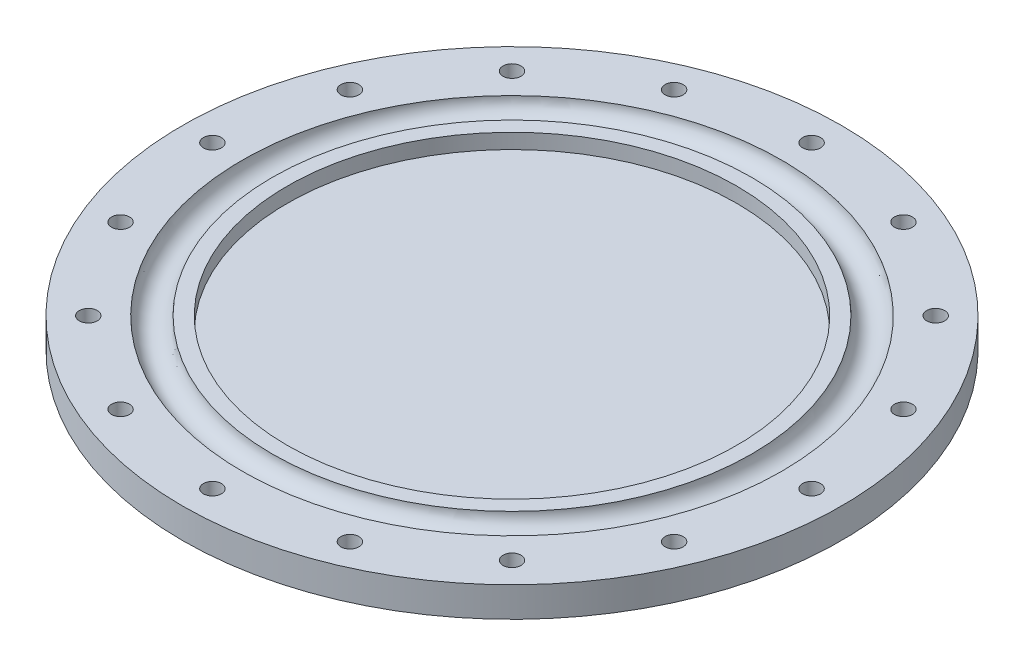
ISO-10303-21;
HEADER;
FILE_DESCRIPTION(('STEP AP214'),'2;1');
FILE_NAME('part.step','',(''),(''),'','','');
FILE_SCHEMA(('AUTOMOTIVE_DESIGN { 1 0 10303 214 1 1 1 1 }'));
ENDSEC;
DATA;
#1=APPLICATION_CONTEXT('core data for automotive mechanical design processes');
#2=APPLICATION_PROTOCOL_DEFINITION('international standard','automotive_design',2000,#1);
#3=PRODUCT_CONTEXT('',#1,'mechanical');
#4=PRODUCT('Part','Part','',(#3));
#5=PRODUCT_RELATED_PRODUCT_CATEGORY('part','',(#4));
#6=PRODUCT_DEFINITION_FORMATION('','',#4);
#7=PRODUCT_DEFINITION_CONTEXT('part definition',#1,'design');
#8=PRODUCT_DEFINITION('design','',#6,#7);
#9=PRODUCT_DEFINITION_SHAPE('','',#8);
#10=(LENGTH_UNIT() NAMED_UNIT(*) SI_UNIT(.MILLI.,.METRE.));
#11=(NAMED_UNIT(*) PLANE_ANGLE_UNIT() SI_UNIT($,.RADIAN.));
#12=(NAMED_UNIT(*) SI_UNIT($,.STERADIAN.) SOLID_ANGLE_UNIT());
#13=UNCERTAINTY_MEASURE_WITH_UNIT(LENGTH_MEASURE(1.E-05),#10,'distance_accuracy_value','');
#14=(GEOMETRIC_REPRESENTATION_CONTEXT(3) GLOBAL_UNCERTAINTY_ASSIGNED_CONTEXT((#13)) GLOBAL_UNIT_ASSIGNED_CONTEXT((#10,
#11,#12)) REPRESENTATION_CONTEXT('',''));
#15=CARTESIAN_POINT('',(0.,0.,0.));
#16=DIRECTION('',(0.,0.,1.));
#17=DIRECTION('',(1.,0.,0.));
#18=AXIS2_PLACEMENT_3D('',#15,#16,#17);
#19=CARTESIAN_POINT('',(0.,10.,0.));
#20=DIRECTION('',(0.,1.,0.));
#21=DIRECTION('',(0.,0.,1.));
#22=AXIS2_PLACEMENT_3D('',#19,#20,#21);
#23=PLANE('',#22);
#24=CARTESIAN_POINT('',(0.,10.,0.));
#25=DIRECTION('',(0.,1.,0.));
#26=DIRECTION('',(0.,0.,1.));
#27=AXIS2_PLACEMENT_3D('',#24,#25,#26);
#28=CIRCLE('',#27,110.);
#29=CARTESIAN_POINT('',(0.,10.,110.));
#30=VERTEX_POINT('',#29);
#31=EDGE_CURVE('E63',#30,#30,#28,.T.);
#32=ORIENTED_EDGE('',*,*,#31,.T.);
#33=EDGE_LOOP('',(#32));
#34=FACE_BOUND('',#33,.T.);
#35=CARTESIAN_POINT('',(0.,10.,-100.));
#36=DIRECTION('',(0.,1.,0.));
#37=DIRECTION('',(0.,0.,1.));
#38=AXIS2_PLACEMENT_3D('',#35,#36,#37);
#39=CIRCLE('',#38,3.);
#40=CARTESIAN_POINT('',(0.,10.,-97.));
#41=VERTEX_POINT('',#40);
#42=EDGE_CURVE('E131',#41,#41,#39,.T.);
#43=ORIENTED_EDGE('',*,*,#42,.F.);
#44=EDGE_LOOP('',(#43));
#45=FACE_BOUND('',#44,.T.);
#46=CARTESIAN_POINT('',(38.2683432365091,10.,-92.3879532511297));
#47=DIRECTION('',(0.,1.,0.));
#48=DIRECTION('',(0.,0.,1.));
#49=AXIS2_PLACEMENT_3D('',#46,#47,#48);
#50=CIRCLE('',#49,3.);
#51=CARTESIAN_POINT('',(38.2683432365091,10.,-89.3879532511297));
#52=VERTEX_POINT('',#51);
#53=EDGE_CURVE('E128',#52,#52,#50,.T.);
#54=ORIENTED_EDGE('',*,*,#53,.F.);
#55=EDGE_LOOP('',(#54));
#56=FACE_BOUND('',#55,.T.);
#57=CARTESIAN_POINT('',(70.7106781186556,10.,-70.7106781186567));
#58=DIRECTION('',(0.,1.,0.));
#59=DIRECTION('',(0.,0.,1.));
#60=AXIS2_PLACEMENT_3D('',#57,#58,#59);
#61=CIRCLE('',#60,3.00000000000001);
#62=CARTESIAN_POINT('',(70.7106781186556,10.,-67.7106781186567));
#63=VERTEX_POINT('',#62);
#64=EDGE_CURVE('E125',#63,#63,#61,.T.);
#65=ORIENTED_EDGE('',*,*,#64,.F.);
#66=EDGE_LOOP('',(#65));
#67=FACE_BOUND('',#66,.T.);
#68=CARTESIAN_POINT('',(92.3879532511304,10.,-38.2683432365115));
#69=DIRECTION('',(0.,1.,0.));
#70=DIRECTION('',(0.,0.,1.));
#71=AXIS2_PLACEMENT_3D('',#68,#69,#70);
#72=CIRCLE('',#71,3.00000000000001);
#73=CARTESIAN_POINT('',(92.3879532511304,10.,-35.2683432365115));
#74=VERTEX_POINT('',#73);
#75=EDGE_CURVE('E122',#74,#74,#72,.T.);
#76=ORIENTED_EDGE('',*,*,#75,.F.);
#77=EDGE_LOOP('',(#76));
#78=FACE_BOUND('',#77,.T.);
#79=CARTESIAN_POINT('',(100.000000000003,10.,-2.76131949507121E-12));
#80=DIRECTION('',(0.,1.,0.));
#81=DIRECTION('',(0.,0.,1.));
#82=AXIS2_PLACEMENT_3D('',#79,#80,#81);
#83=CIRCLE('',#82,3.00000000000001);
#84=CARTESIAN_POINT('',(100.000000000003,10.,2.99999999999725));
#85=VERTEX_POINT('',#84);
#86=EDGE_CURVE('E119',#85,#85,#83,.T.);
#87=ORIENTED_EDGE('',*,*,#86,.F.);
#88=EDGE_LOOP('',(#87));
#89=FACE_BOUND('',#88,.T.);
#90=CARTESIAN_POINT('',(92.3879532511325,10.,38.2683432365064));
#91=DIRECTION('',(0.,1.,0.));
#92=DIRECTION('',(0.,0.,1.));
#93=AXIS2_PLACEMENT_3D('',#90,#91,#92);
#94=CIRCLE('',#93,3.00000000000001);
#95=CARTESIAN_POINT('',(92.3879532511325,10.,41.2683432365064));
#96=VERTEX_POINT('',#95);
#97=EDGE_CURVE('E116',#96,#96,#94,.T.);
#98=ORIENTED_EDGE('',*,*,#97,.F.);
#99=EDGE_LOOP('',(#98));
#100=FACE_BOUND('',#99,.T.);
#101=CARTESIAN_POINT('',(70.7106781186595,10.,70.7106781186528));
#102=DIRECTION('',(0.,1.,0.));
#103=DIRECTION('',(0.,0.,1.));
#104=AXIS2_PLACEMENT_3D('',#101,#102,#103);
#105=CIRCLE('',#104,3.00000000000001);
#106=CARTESIAN_POINT('',(70.7106781186595,10.,73.7106781186528));
#107=VERTEX_POINT('',#106);
#108=EDGE_CURVE('E113',#107,#107,#105,.T.);
#109=ORIENTED_EDGE('',*,*,#108,.F.);
#110=EDGE_LOOP('',(#109));
#111=FACE_BOUND('',#110,.T.);
#112=CARTESIAN_POINT('',(38.2683432365143,10.,92.3879532511276));
#113=DIRECTION('',(0.,1.,0.));
#114=DIRECTION('',(0.,0.,1.));
#115=AXIS2_PLACEMENT_3D('',#112,#113,#114);
#116=CIRCLE('',#115,3.);
#117=CARTESIAN_POINT('',(38.2683432365143,10.,95.3879532511276));
#118=VERTEX_POINT('',#117);
#119=EDGE_CURVE('E110',#118,#118,#116,.T.);
#120=ORIENTED_EDGE('',*,*,#119,.F.);
#121=EDGE_LOOP('',(#120));
#122=FACE_BOUND('',#121,.T.);
#123=CARTESIAN_POINT('',(5.52263899014242E-12,10.,100.));
#124=DIRECTION('',(0.,1.,0.));
#125=DIRECTION('',(0.,0.,1.));
#126=AXIS2_PLACEMENT_3D('',#123,#124,#125);
#127=CIRCLE('',#126,3.);
#128=CARTESIAN_POINT('',(5.52263899014242E-12,10.,103.));
#129=VERTEX_POINT('',#128);
#130=EDGE_CURVE('E107',#129,#129,#127,.T.);
#131=ORIENTED_EDGE('',*,*,#130,.F.);
#132=EDGE_LOOP('',(#131));
#133=FACE_BOUND('',#132,.T.);
#134=CARTESIAN_POINT('',(-38.2683432365037,10.,92.3879532511297));
#135=DIRECTION('',(0.,1.,0.));
#136=DIRECTION('',(0.,0.,1.));
#137=AXIS2_PLACEMENT_3D('',#134,#135,#136);
#138=CIRCLE('',#137,3.);
#139=CARTESIAN_POINT('',(-38.2683432365037,10.,95.3879532511298));
#140=VERTEX_POINT('',#139);
#141=EDGE_CURVE('E104',#140,#140,#138,.T.);
#142=ORIENTED_EDGE('',*,*,#141,.F.);
#143=EDGE_LOOP('',(#142));
#144=FACE_BOUND('',#143,.T.);
#145=CARTESIAN_POINT('',(-70.7106781186501,10.,70.7106781186567));
#146=DIRECTION('',(0.,1.,0.));
#147=DIRECTION('',(0.,0.,1.));
#148=AXIS2_PLACEMENT_3D('',#145,#146,#147);
#149=CIRCLE('',#148,3.00000000000001);
#150=CARTESIAN_POINT('',(-70.7106781186501,10.,73.7106781186567));
#151=VERTEX_POINT('',#150);
#152=EDGE_CURVE('E101',#151,#151,#149,.T.);
#153=ORIENTED_EDGE('',*,*,#152,.F.);
#154=EDGE_LOOP('',(#153));
#155=FACE_BOUND('',#154,.T.);
#156=CARTESIAN_POINT('',(-92.3879532511248,10.,38.2683432365116));
#157=DIRECTION('',(0.,1.,0.));
#158=DIRECTION('',(0.,0.,1.));
#159=AXIS2_PLACEMENT_3D('',#156,#157,#158);
#160=CIRCLE('',#159,3.00000000000001);
#161=CARTESIAN_POINT('',(-92.3879532511248,10.,41.2683432365116));
#162=VERTEX_POINT('',#161);
#163=EDGE_CURVE('E98',#162,#162,#160,.T.);
#164=ORIENTED_EDGE('',*,*,#163,.F.);
#165=EDGE_LOOP('',(#164));
#166=FACE_BOUND('',#165,.T.);
#167=CARTESIAN_POINT('',(-99.9999999999973,10.,2.77356596306269E-12));
#168=DIRECTION('',(0.,1.,0.));
#169=DIRECTION('',(0.,0.,1.));
#170=AXIS2_PLACEMENT_3D('',#167,#168,#169);
#171=CIRCLE('',#170,3.00000000000001);
#172=CARTESIAN_POINT('',(-99.9999999999973,10.,3.00000000000278));
#173=VERTEX_POINT('',#172);
#174=EDGE_CURVE('E95',#173,#173,#171,.T.);
#175=ORIENTED_EDGE('',*,*,#174,.F.);
#176=EDGE_LOOP('',(#175));
#177=FACE_BOUND('',#176,.T.);
#178=CARTESIAN_POINT('',(-92.387953251127,10.,-38.2683432365065));
#179=DIRECTION('',(0.,1.,0.));
#180=DIRECTION('',(0.,0.,1.));
#181=AXIS2_PLACEMENT_3D('',#178,#179,#180);
#182=CIRCLE('',#181,3.00000000000001);
#183=CARTESIAN_POINT('',(-92.387953251127,10.,-35.2683432365065));
#184=VERTEX_POINT('',#183);
#185=EDGE_CURVE('E92',#184,#184,#182,.T.);
#186=ORIENTED_EDGE('',*,*,#185,.F.);
#187=EDGE_LOOP('',(#186));
#188=FACE_BOUND('',#187,.T.);
#189=CARTESIAN_POINT('',(-70.710678118654,10.,-70.7106781186528));
#190=DIRECTION('',(0.,1.,0.));
#191=DIRECTION('',(0.,0.,1.));
#192=AXIS2_PLACEMENT_3D('',#189,#190,#191);
#193=CIRCLE('',#192,3.00000000000001);
#194=CARTESIAN_POINT('',(-70.710678118654,10.,-67.7106781186528));
#195=VERTEX_POINT('',#194);
#196=EDGE_CURVE('E88',#195,#195,#193,.T.);
#197=ORIENTED_EDGE('',*,*,#196,.F.);
#198=EDGE_LOOP('',(#197));
#199=FACE_BOUND('',#198,.T.);
#200=CARTESIAN_POINT('',(-38.2683432365088,10.,-92.3879532511276));
#201=DIRECTION('',(0.,1.,0.));
#202=DIRECTION('',(0.,0.,1.));
#203=AXIS2_PLACEMENT_3D('',#200,#201,#202);
#204=CIRCLE('',#203,3.);
#205=CARTESIAN_POINT('',(-38.2683432365088,10.,-89.3879532511276));
#206=VERTEX_POINT('',#205);
#207=EDGE_CURVE('E85',#206,#206,#204,.T.);
#208=ORIENTED_EDGE('',*,*,#207,.F.);
#209=EDGE_LOOP('',(#208));
#210=FACE_BOUND('',#209,.T.);
#211=CARTESIAN_POINT('',(0.,10.,0.));
#212=DIRECTION('',(0.,1.,0.));
#213=DIRECTION('',(1.,0.,0.));
#214=AXIS2_PLACEMENT_3D('',#211,#212,#213);
#215=CIRCLE('',#214,90.);
#216=CARTESIAN_POINT('',(90.,10.,0.));
#217=VERTEX_POINT('',#216);
#218=EDGE_CURVE('E70',#217,#217,#215,.T.);
#219=ORIENTED_EDGE('',*,*,#218,.F.);
#220=EDGE_LOOP('',(#219));
#221=FACE_BOUND('',#220,.T.);
#222=ADVANCED_FACE('F55',(#34,#45,#56,#67,#78,#89,#100,#111,#122,#133,#144,#155,#166,#177,#188,
#199,#210,#221),#23,.T.);
#223=CARTESIAN_POINT('',(0.,10.,-100.));
#224=DIRECTION('',(0.,-1.,0.));
#225=DIRECTION('',(0.,0.,-1.));
#226=AXIS2_PLACEMENT_3D('',#223,#224,#225);
#227=CYLINDRICAL_SURFACE('',#226,3.);
#228=ORIENTED_EDGE('',*,*,#42,.T.);
#229=EDGE_LOOP('',(#228));
#230=FACE_BOUND('',#229,.T.);
#231=CARTESIAN_POINT('',(0.,0.,-100.));
#232=DIRECTION('',(0.,1.,0.));
#233=DIRECTION('',(0.,0.,1.));
#234=AXIS2_PLACEMENT_3D('',#231,#232,#233);
#235=CIRCLE('',#234,3.);
#236=CARTESIAN_POINT('',(0.,0.,-97.));
#237=VERTEX_POINT('',#236);
#238=EDGE_CURVE('E180',#237,#237,#235,.T.);
#239=ORIENTED_EDGE('',*,*,#238,.F.);
#240=EDGE_LOOP('',(#239));
#241=FACE_BOUND('',#240,.T.);
#242=ADVANCED_FACE('F202',(#230,#241),#227,.F.);
#243=CARTESIAN_POINT('',(38.2683432365091,10.,-92.3879532511297));
#244=DIRECTION('',(0.,-1.,0.));
#245=DIRECTION('',(0.,0.,-1.));
#246=AXIS2_PLACEMENT_3D('',#243,#244,#245);
#247=CYLINDRICAL_SURFACE('',#246,3.);
#248=ORIENTED_EDGE('',*,*,#53,.T.);
#249=EDGE_LOOP('',(#248));
#250=FACE_BOUND('',#249,.T.);
#251=CARTESIAN_POINT('',(38.2683432365091,0.,-92.3879532511297));
#252=DIRECTION('',(0.,1.,0.));
#253=DIRECTION('',(0.,0.,1.));
#254=AXIS2_PLACEMENT_3D('',#251,#252,#253);
#255=CIRCLE('',#254,3.);
#256=CARTESIAN_POINT('',(38.2683432365091,0.,-89.3879532511297));
#257=VERTEX_POINT('',#256);
#258=EDGE_CURVE('E177',#257,#257,#255,.T.);
#259=ORIENTED_EDGE('',*,*,#258,.F.);
#260=EDGE_LOOP('',(#259));
#261=FACE_BOUND('',#260,.T.);
#262=ADVANCED_FACE('F208',(#250,#261),#247,.F.);
#263=CARTESIAN_POINT('',(70.7106781186556,10.,-70.7106781186567));
#264=DIRECTION('',(0.,-1.,0.));
#265=DIRECTION('',(0.,0.,-1.));
#266=AXIS2_PLACEMENT_3D('',#263,#264,#265);
#267=CYLINDRICAL_SURFACE('',#266,3.00000000000001);
#268=ORIENTED_EDGE('',*,*,#64,.T.);
#269=EDGE_LOOP('',(#268));
#270=FACE_BOUND('',#269,.T.);
#271=CARTESIAN_POINT('',(70.7106781186556,0.,-70.7106781186567));
#272=DIRECTION('',(0.,1.,0.));
#273=DIRECTION('',(0.,0.,1.));
#274=AXIS2_PLACEMENT_3D('',#271,#272,#273);
#275=CIRCLE('',#274,3.00000000000001);
#276=CARTESIAN_POINT('',(70.7106781186556,0.,-67.7106781186567));
#277=VERTEX_POINT('',#276);
#278=EDGE_CURVE('E174',#277,#277,#275,.T.);
#279=ORIENTED_EDGE('',*,*,#278,.F.);
#280=EDGE_LOOP('',(#279));
#281=FACE_BOUND('',#280,.T.);
#282=ADVANCED_FACE('F406',(#270,#281),#267,.F.);
#283=CARTESIAN_POINT('',(92.3879532511304,10.,-38.2683432365115));
#284=DIRECTION('',(0.,-1.,0.));
#285=DIRECTION('',(0.,0.,-1.));
#286=AXIS2_PLACEMENT_3D('',#283,#284,#285);
#287=CYLINDRICAL_SURFACE('',#286,3.00000000000001);
#288=ORIENTED_EDGE('',*,*,#75,.T.);
#289=EDGE_LOOP('',(#288));
#290=FACE_BOUND('',#289,.T.);
#291=CARTESIAN_POINT('',(92.3879532511304,0.,-38.2683432365115));
#292=DIRECTION('',(0.,1.,0.));
#293=DIRECTION('',(0.,0.,1.));
#294=AXIS2_PLACEMENT_3D('',#291,#292,#293);
#295=CIRCLE('',#294,3.00000000000001);
#296=CARTESIAN_POINT('',(92.3879532511304,0.,-35.2683432365115));
#297=VERTEX_POINT('',#296);
#298=EDGE_CURVE('E171',#297,#297,#295,.T.);
#299=ORIENTED_EDGE('',*,*,#298,.F.);
#300=EDGE_LOOP('',(#299));
#301=FACE_BOUND('',#300,.T.);
#302=ADVANCED_FACE('F396',(#290,#301),#287,.F.);
#303=CARTESIAN_POINT('',(100.000000000003,10.,-2.76131949507121E-12));
#304=DIRECTION('',(0.,-1.,0.));
#305=DIRECTION('',(0.,0.,-1.));
#306=AXIS2_PLACEMENT_3D('',#303,#304,#305);
#307=CYLINDRICAL_SURFACE('',#306,3.00000000000001);
#308=ORIENTED_EDGE('',*,*,#86,.T.);
#309=EDGE_LOOP('',(#308));
#310=FACE_BOUND('',#309,.T.);
#311=CARTESIAN_POINT('',(100.000000000003,0.,-2.76131949507121E-12));
#312=DIRECTION('',(0.,1.,0.));
#313=DIRECTION('',(0.,0.,1.));
#314=AXIS2_PLACEMENT_3D('',#311,#312,#313);
#315=CIRCLE('',#314,3.00000000000001);
#316=CARTESIAN_POINT('',(100.000000000003,0.,2.99999999999725));
#317=VERTEX_POINT('',#316);
#318=EDGE_CURVE('E168',#317,#317,#315,.T.);
#319=ORIENTED_EDGE('',*,*,#318,.F.);
#320=EDGE_LOOP('',(#319));
#321=FACE_BOUND('',#320,.T.);
#322=ADVANCED_FACE('F386',(#310,#321),#307,.F.);
#323=CARTESIAN_POINT('',(92.3879532511325,10.,38.2683432365064));
#324=DIRECTION('',(0.,-1.,0.));
#325=DIRECTION('',(0.,0.,-1.));
#326=AXIS2_PLACEMENT_3D('',#323,#324,#325);
#327=CYLINDRICAL_SURFACE('',#326,3.00000000000001);
#328=ORIENTED_EDGE('',*,*,#97,.T.);
#329=EDGE_LOOP('',(#328));
#330=FACE_BOUND('',#329,.T.);
#331=CARTESIAN_POINT('',(92.3879532511325,0.,38.2683432365064));
#332=DIRECTION('',(0.,1.,0.));
#333=DIRECTION('',(0.,0.,1.));
#334=AXIS2_PLACEMENT_3D('',#331,#332,#333);
#335=CIRCLE('',#334,3.00000000000001);
#336=CARTESIAN_POINT('',(92.3879532511325,0.,41.2683432365064));
#337=VERTEX_POINT('',#336);
#338=EDGE_CURVE('E165',#337,#337,#335,.T.);
#339=ORIENTED_EDGE('',*,*,#338,.F.);
#340=EDGE_LOOP('',(#339));
#341=FACE_BOUND('',#340,.T.);
#342=ADVANCED_FACE('F376',(#330,#341),#327,.F.);
#343=CARTESIAN_POINT('',(70.7106781186595,10.,70.7106781186528));
#344=DIRECTION('',(0.,-1.,0.));
#345=DIRECTION('',(0.,0.,-1.));
#346=AXIS2_PLACEMENT_3D('',#343,#344,#345);
#347=CYLINDRICAL_SURFACE('',#346,3.00000000000001);
#348=ORIENTED_EDGE('',*,*,#108,.T.);
#349=EDGE_LOOP('',(#348));
#350=FACE_BOUND('',#349,.T.);
#351=CARTESIAN_POINT('',(70.7106781186595,0.,70.7106781186528));
#352=DIRECTION('',(0.,1.,0.));
#353=DIRECTION('',(0.,0.,1.));
#354=AXIS2_PLACEMENT_3D('',#351,#352,#353);
#355=CIRCLE('',#354,3.00000000000001);
#356=CARTESIAN_POINT('',(70.7106781186595,0.,73.7106781186528));
#357=VERTEX_POINT('',#356);
#358=EDGE_CURVE('E162',#357,#357,#355,.T.);
#359=ORIENTED_EDGE('',*,*,#358,.F.);
#360=EDGE_LOOP('',(#359));
#361=FACE_BOUND('',#360,.T.);
#362=ADVANCED_FACE('F366',(#350,#361),#347,.F.);
#363=CARTESIAN_POINT('',(38.2683432365143,10.,92.3879532511276));
#364=DIRECTION('',(0.,-1.,0.));
#365=DIRECTION('',(0.,0.,-1.));
#366=AXIS2_PLACEMENT_3D('',#363,#364,#365);
#367=CYLINDRICAL_SURFACE('',#366,3.);
#368=ORIENTED_EDGE('',*,*,#119,.T.);
#369=EDGE_LOOP('',(#368));
#370=FACE_BOUND('',#369,.T.);
#371=CARTESIAN_POINT('',(38.2683432365143,0.,92.3879532511276));
#372=DIRECTION('',(0.,1.,0.));
#373=DIRECTION('',(0.,0.,1.));
#374=AXIS2_PLACEMENT_3D('',#371,#372,#373);
#375=CIRCLE('',#374,3.);
#376=CARTESIAN_POINT('',(38.2683432365143,0.,95.3879532511276));
#377=VERTEX_POINT('',#376);
#378=EDGE_CURVE('E159',#377,#377,#375,.T.);
#379=ORIENTED_EDGE('',*,*,#378,.F.);
#380=EDGE_LOOP('',(#379));
#381=FACE_BOUND('',#380,.T.);
#382=ADVANCED_FACE('F356',(#370,#381),#367,.F.);
#383=CARTESIAN_POINT('',(5.52263899014242E-12,10.,100.));
#384=DIRECTION('',(0.,-1.,0.));
#385=DIRECTION('',(0.,0.,-1.));
#386=AXIS2_PLACEMENT_3D('',#383,#384,#385);
#387=CYLINDRICAL_SURFACE('',#386,3.);
#388=ORIENTED_EDGE('',*,*,#130,.T.);
#389=EDGE_LOOP('',(#388));
#390=FACE_BOUND('',#389,.T.);
#391=CARTESIAN_POINT('',(5.52263899014242E-12,0.,100.));
#392=DIRECTION('',(0.,1.,0.));
#393=DIRECTION('',(0.,0.,1.));
#394=AXIS2_PLACEMENT_3D('',#391,#392,#393);
#395=CIRCLE('',#394,3.);
#396=CARTESIAN_POINT('',(5.52263899014242E-12,0.,103.));
#397=VERTEX_POINT('',#396);
#398=EDGE_CURVE('E156',#397,#397,#395,.T.);
#399=ORIENTED_EDGE('',*,*,#398,.F.);
#400=EDGE_LOOP('',(#399));
#401=FACE_BOUND('',#400,.T.);
#402=ADVANCED_FACE('F346',(#390,#401),#387,.F.);
#403=CARTESIAN_POINT('',(-38.2683432365037,10.,92.3879532511297));
#404=DIRECTION('',(0.,-1.,0.));
#405=DIRECTION('',(0.,0.,-1.));
#406=AXIS2_PLACEMENT_3D('',#403,#404,#405);
#407=CYLINDRICAL_SURFACE('',#406,3.);
#408=ORIENTED_EDGE('',*,*,#141,.T.);
#409=EDGE_LOOP('',(#408));
#410=FACE_BOUND('',#409,.T.);
#411=CARTESIAN_POINT('',(-38.2683432365037,0.,92.3879532511297));
#412=DIRECTION('',(0.,1.,0.));
#413=DIRECTION('',(0.,0.,1.));
#414=AXIS2_PLACEMENT_3D('',#411,#412,#413);
#415=CIRCLE('',#414,3.);
#416=CARTESIAN_POINT('',(-38.2683432365037,0.,95.3879532511298));
#417=VERTEX_POINT('',#416);
#418=EDGE_CURVE('E153',#417,#417,#415,.T.);
#419=ORIENTED_EDGE('',*,*,#418,.F.);
#420=EDGE_LOOP('',(#419));
#421=FACE_BOUND('',#420,.T.);
#422=ADVANCED_FACE('F336',(#410,#421),#407,.F.);
#423=CARTESIAN_POINT('',(-70.7106781186501,10.,70.7106781186567));
#424=DIRECTION('',(0.,-1.,0.));
#425=DIRECTION('',(0.,0.,-1.));
#426=AXIS2_PLACEMENT_3D('',#423,#424,#425);
#427=CYLINDRICAL_SURFACE('',#426,3.00000000000001);
#428=ORIENTED_EDGE('',*,*,#152,.T.);
#429=EDGE_LOOP('',(#428));
#430=FACE_BOUND('',#429,.T.);
#431=CARTESIAN_POINT('',(-70.7106781186501,0.,70.7106781186567));
#432=DIRECTION('',(0.,1.,0.));
#433=DIRECTION('',(0.,0.,1.));
#434=AXIS2_PLACEMENT_3D('',#431,#432,#433);
#435=CIRCLE('',#434,3.00000000000001);
#436=CARTESIAN_POINT('',(-70.7106781186501,0.,73.7106781186567));
#437=VERTEX_POINT('',#436);
#438=EDGE_CURVE('E150',#437,#437,#435,.T.);
#439=ORIENTED_EDGE('',*,*,#438,.F.);
#440=EDGE_LOOP('',(#439));
#441=FACE_BOUND('',#440,.T.);
#442=ADVANCED_FACE('F326',(#430,#441),#427,.F.);
#443=CARTESIAN_POINT('',(-92.3879532511248,10.,38.2683432365116));
#444=DIRECTION('',(0.,-1.,0.));
#445=DIRECTION('',(0.,0.,-1.));
#446=AXIS2_PLACEMENT_3D('',#443,#444,#445);
#447=CYLINDRICAL_SURFACE('',#446,3.00000000000001);
#448=ORIENTED_EDGE('',*,*,#163,.T.);
#449=EDGE_LOOP('',(#448));
#450=FACE_BOUND('',#449,.T.);
#451=CARTESIAN_POINT('',(-92.3879532511248,0.,38.2683432365116));
#452=DIRECTION('',(0.,1.,0.));
#453=DIRECTION('',(0.,0.,1.));
#454=AXIS2_PLACEMENT_3D('',#451,#452,#453);
#455=CIRCLE('',#454,3.00000000000001);
#456=CARTESIAN_POINT('',(-92.3879532511248,0.,41.2683432365116));
#457=VERTEX_POINT('',#456);
#458=EDGE_CURVE('E147',#457,#457,#455,.T.);
#459=ORIENTED_EDGE('',*,*,#458,.F.);
#460=EDGE_LOOP('',(#459));
#461=FACE_BOUND('',#460,.T.);
#462=ADVANCED_FACE('F316',(#450,#461),#447,.F.);
#463=CARTESIAN_POINT('',(-99.9999999999973,10.,2.77356596306269E-12));
#464=DIRECTION('',(0.,-1.,0.));
#465=DIRECTION('',(0.,0.,-1.));
#466=AXIS2_PLACEMENT_3D('',#463,#464,#465);
#467=CYLINDRICAL_SURFACE('',#466,3.00000000000001);
#468=ORIENTED_EDGE('',*,*,#174,.T.);
#469=EDGE_LOOP('',(#468));
#470=FACE_BOUND('',#469,.T.);
#471=CARTESIAN_POINT('',(-99.9999999999973,0.,2.77356596306269E-12));
#472=DIRECTION('',(0.,1.,0.));
#473=DIRECTION('',(0.,0.,1.));
#474=AXIS2_PLACEMENT_3D('',#471,#472,#473);
#475=CIRCLE('',#474,3.00000000000001);
#476=CARTESIAN_POINT('',(-99.9999999999973,0.,3.00000000000278));
#477=VERTEX_POINT('',#476);
#478=EDGE_CURVE('E144',#477,#477,#475,.T.);
#479=ORIENTED_EDGE('',*,*,#478,.F.);
#480=EDGE_LOOP('',(#479));
#481=FACE_BOUND('',#480,.T.);
#482=ADVANCED_FACE('F306',(#470,#481),#467,.F.);
#483=CARTESIAN_POINT('',(-92.387953251127,10.,-38.2683432365065));
#484=DIRECTION('',(0.,-1.,0.));
#485=DIRECTION('',(0.,0.,-1.));
#486=AXIS2_PLACEMENT_3D('',#483,#484,#485);
#487=CYLINDRICAL_SURFACE('',#486,3.00000000000001);
#488=ORIENTED_EDGE('',*,*,#185,.T.);
#489=EDGE_LOOP('',(#488));
#490=FACE_BOUND('',#489,.T.);
#491=CARTESIAN_POINT('',(-92.387953251127,0.,-38.2683432365065));
#492=DIRECTION('',(0.,1.,0.));
#493=DIRECTION('',(0.,0.,1.));
#494=AXIS2_PLACEMENT_3D('',#491,#492,#493);
#495=CIRCLE('',#494,3.00000000000001);
#496=CARTESIAN_POINT('',(-92.387953251127,0.,-35.2683432365065));
#497=VERTEX_POINT('',#496);
#498=EDGE_CURVE('E141',#497,#497,#495,.T.);
#499=ORIENTED_EDGE('',*,*,#498,.F.);
#500=EDGE_LOOP('',(#499));
#501=FACE_BOUND('',#500,.T.);
#502=ADVANCED_FACE('F297',(#490,#501),#487,.F.);
#503=CARTESIAN_POINT('',(-70.710678118654,10.,-70.7106781186528));
#504=DIRECTION('',(0.,-1.,0.));
#505=DIRECTION('',(0.,0.,-1.));
#506=AXIS2_PLACEMENT_3D('',#503,#504,#505);
#507=CYLINDRICAL_SURFACE('',#506,3.00000000000001);
#508=ORIENTED_EDGE('',*,*,#196,.T.);
#509=EDGE_LOOP('',(#508));
#510=FACE_BOUND('',#509,.T.);
#511=CARTESIAN_POINT('',(-70.710678118654,0.,-70.7106781186528));
#512=DIRECTION('',(0.,1.,0.));
#513=DIRECTION('',(0.,0.,1.));
#514=AXIS2_PLACEMENT_3D('',#511,#512,#513);
#515=CIRCLE('',#514,3.00000000000001);
#516=CARTESIAN_POINT('',(-70.710678118654,0.,-67.7106781186528));
#517=VERTEX_POINT('',#516);
#518=EDGE_CURVE('E138',#517,#517,#515,.T.);
#519=ORIENTED_EDGE('',*,*,#518,.F.);
#520=EDGE_LOOP('',(#519));
#521=FACE_BOUND('',#520,.T.);
#522=ADVANCED_FACE('F288',(#510,#521),#507,.F.);
#523=CARTESIAN_POINT('',(-38.2683432365088,10.,-92.3879532511276));
#524=DIRECTION('',(0.,-1.,0.));
#525=DIRECTION('',(0.,0.,-1.));
#526=AXIS2_PLACEMENT_3D('',#523,#524,#525);
#527=CYLINDRICAL_SURFACE('',#526,3.);
#528=ORIENTED_EDGE('',*,*,#207,.T.);
#529=EDGE_LOOP('',(#528));
#530=FACE_BOUND('',#529,.T.);
#531=CARTESIAN_POINT('',(-38.2683432365088,0.,-92.3879532511276));
#532=DIRECTION('',(0.,1.,0.));
#533=DIRECTION('',(0.,0.,1.));
#534=AXIS2_PLACEMENT_3D('',#531,#532,#533);
#535=CIRCLE('',#534,3.);
#536=CARTESIAN_POINT('',(-38.2683432365088,0.,-89.3879532511276));
#537=VERTEX_POINT('',#536);
#538=EDGE_CURVE('E84',#537,#537,#535,.T.);
#539=ORIENTED_EDGE('',*,*,#538,.F.);
#540=EDGE_LOOP('',(#539));
#541=FACE_BOUND('',#540,.T.);
#542=ADVANCED_FACE('F57',(#530,#541),#527,.F.);
#543=CARTESIAN_POINT('',(0.,10.,0.));
#544=DIRECTION('',(0.,-1.,0.));
#545=DIRECTION('',(0.,0.,-1.));
#546=AXIS2_PLACEMENT_3D('',#543,#544,#545);
#547=CYLINDRICAL_SURFACE('',#546,110.);
#548=ORIENTED_EDGE('',*,*,#31,.F.);
#549=EDGE_LOOP('',(#548));
#550=FACE_BOUND('',#549,.T.);
#551=CARTESIAN_POINT('',(0.,0.,0.));
#552=DIRECTION('',(0.,1.,0.));
#553=DIRECTION('',(0.,0.,1.));
#554=AXIS2_PLACEMENT_3D('',#551,#552,#553);
#555=CIRCLE('',#554,110.);
#556=CARTESIAN_POINT('',(0.,0.,110.));
#557=VERTEX_POINT('',#556);
#558=EDGE_CURVE('E89',#557,#557,#555,.T.);
#559=ORIENTED_EDGE('',*,*,#558,.T.);
#560=EDGE_LOOP('',(#559));
#561=FACE_BOUND('',#560,.T.);
#562=ADVANCED_FACE('F185',(#550,#561),#547,.T.);
#563=CARTESIAN_POINT('',(0.,0.,0.));
#564=DIRECTION('',(0.,1.,0.));
#565=DIRECTION('',(0.,0.,1.));
#566=AXIS2_PLACEMENT_3D('',#563,#564,#565);
#567=PLANE('',#566);
#568=ORIENTED_EDGE('',*,*,#538,.T.);
#569=EDGE_LOOP('',(#568));
#570=FACE_BOUND('',#569,.T.);
#571=ORIENTED_EDGE('',*,*,#518,.T.);
#572=EDGE_LOOP('',(#571));
#573=FACE_BOUND('',#572,.T.);
#574=ORIENTED_EDGE('',*,*,#498,.T.);
#575=EDGE_LOOP('',(#574));
#576=FACE_BOUND('',#575,.T.);
#577=ORIENTED_EDGE('',*,*,#478,.T.);
#578=EDGE_LOOP('',(#577));
#579=FACE_BOUND('',#578,.T.);
#580=ORIENTED_EDGE('',*,*,#458,.T.);
#581=EDGE_LOOP('',(#580));
#582=FACE_BOUND('',#581,.T.);
#583=ORIENTED_EDGE('',*,*,#438,.T.);
#584=EDGE_LOOP('',(#583));
#585=FACE_BOUND('',#584,.T.);
#586=ORIENTED_EDGE('',*,*,#418,.T.);
#587=EDGE_LOOP('',(#586));
#588=FACE_BOUND('',#587,.T.);
#589=ORIENTED_EDGE('',*,*,#398,.T.);
#590=EDGE_LOOP('',(#589));
#591=FACE_BOUND('',#590,.T.);
#592=ORIENTED_EDGE('',*,*,#378,.T.);
#593=EDGE_LOOP('',(#592));
#594=FACE_BOUND('',#593,.T.);
#595=ORIENTED_EDGE('',*,*,#358,.T.);
#596=EDGE_LOOP('',(#595));
#597=FACE_BOUND('',#596,.T.);
#598=ORIENTED_EDGE('',*,*,#338,.T.);
#599=EDGE_LOOP('',(#598));
#600=FACE_BOUND('',#599,.T.);
#601=ORIENTED_EDGE('',*,*,#318,.T.);
#602=EDGE_LOOP('',(#601));
#603=FACE_BOUND('',#602,.T.);
#604=ORIENTED_EDGE('',*,*,#298,.T.);
#605=EDGE_LOOP('',(#604));
#606=FACE_BOUND('',#605,.T.);
#607=ORIENTED_EDGE('',*,*,#278,.T.);
#608=EDGE_LOOP('',(#607));
#609=FACE_BOUND('',#608,.T.);
#610=ORIENTED_EDGE('',*,*,#258,.T.);
#611=EDGE_LOOP('',(#610));
#612=FACE_BOUND('',#611,.T.);
#613=ORIENTED_EDGE('',*,*,#238,.T.);
#614=EDGE_LOOP('',(#613));
#615=FACE_BOUND('',#614,.T.);
#616=ORIENTED_EDGE('',*,*,#558,.F.);
#617=EDGE_LOOP('',(#616));
#618=FACE_BOUND('',#617,.T.);
#619=ADVANCED_FACE('F187',(#570,#573,#576,#579,#582,#585,#588,#591,#594,#597,#600,#603,#606,
#609,#612,#615,#618),#567,.F.);
#620=CARTESIAN_POINT('',(0.,10.,0.));
#621=DIRECTION('',(0.,1.,0.));
#622=DIRECTION('',(0.,0.,1.));
#623=AXIS2_PLACEMENT_3D('',#620,#621,#622);
#624=TOROIDAL_SURFACE('',#623,85.,5.);
#625=CARTESIAN_POINT('',(85.,10.,0.));
#626=DIRECTION('',(0.,0.,1.));
#627=DIRECTION('',(1.,0.,0.));
#628=AXIS2_PLACEMENT_3D('',#625,#626,#627);
#629=CIRCLE('',#628,5.);
#630=CARTESIAN_POINT('',(80.,10.,0.));
#631=VERTEX_POINT('',#630);
#632=EDGE_CURVE('E75',#631,#217,#629,.T.);
#633=ORIENTED_EDGE('',*,*,#632,.F.);
#634=CARTESIAN_POINT('',(0.,10.,0.));
#635=DIRECTION('',(0.,1.,0.));
#636=DIRECTION('',(1.,0.,0.));
#637=AXIS2_PLACEMENT_3D('',#634,#635,#636);
#638=CIRCLE('',#637,80.);
#639=EDGE_CURVE('E73',#631,#631,#638,.T.);
#640=ORIENTED_EDGE('',*,*,#639,.F.);
#641=ORIENTED_EDGE('',*,*,#632,.T.);
#642=ORIENTED_EDGE('',*,*,#218,.T.);
#643=EDGE_LOOP('',(#633,#640,#641,#642));
#644=FACE_BOUND('',#643,.T.);
#645=ADVANCED_FACE('F74',(#644),#624,.F.);
#646=CARTESIAN_POINT('',(0.,5.,0.));
#647=DIRECTION('',(0.,1.,0.));
#648=DIRECTION('',(0.,0.,1.));
#649=AXIS2_PLACEMENT_3D('',#646,#647,#648);
#650=PLANE('',#649);
#651=CARTESIAN_POINT('',(0.,5.,0.));
#652=DIRECTION('',(0.,1.,0.));
#653=DIRECTION('',(0.,0.,1.));
#654=AXIS2_PLACEMENT_3D('',#651,#652,#653);
#655=CIRCLE('',#654,75.);
#656=CARTESIAN_POINT('',(0.,5.,75.));
#657=VERTEX_POINT('',#656);
#658=EDGE_CURVE('E12',#657,#657,#655,.T.);
#659=ORIENTED_EDGE('',*,*,#658,.T.);
#660=EDGE_LOOP('',(#659));
#661=FACE_BOUND('',#660,.T.);
#662=ADVANCED_FACE('F195',(#661),#650,.T.);
#663=CARTESIAN_POINT('',(0.,10.,0.));
#664=DIRECTION('',(0.,-1.,0.));
#665=DIRECTION('',(0.,0.,-1.));
#666=AXIS2_PLACEMENT_3D('',#663,#664,#665);
#667=CYLINDRICAL_SURFACE('',#666,75.);
#668=ORIENTED_EDGE('',*,*,#658,.F.);
#669=EDGE_LOOP('',(#668));
#670=FACE_BOUND('',#669,.T.);
#671=CARTESIAN_POINT('',(0.,10.,0.));
#672=DIRECTION('',(0.,1.,0.));
#673=DIRECTION('',(0.,0.,1.));
#674=AXIS2_PLACEMENT_3D('',#671,#672,#673);
#675=CIRCLE('',#674,75.);
#676=CARTESIAN_POINT('',(0.,10.,75.));
#677=VERTEX_POINT('',#676);
#678=EDGE_CURVE('E78',#677,#677,#675,.T.);
#679=ORIENTED_EDGE('',*,*,#678,.T.);
#680=EDGE_LOOP('',(#679));
#681=FACE_BOUND('',#680,.T.);
#682=ADVANCED_FACE('F214',(#670,#681),#667,.F.);
#683=ORIENTED_EDGE('',*,*,#678,.F.);
#684=EDGE_LOOP('',(#683));
#685=FACE_BOUND('',#684,.T.);
#686=ORIENTED_EDGE('',*,*,#639,.T.);
#687=EDGE_LOOP('',(#686));
#688=FACE_BOUND('',#687,.T.);
#689=ADVANCED_FACE('F204',(#685,#688),#23,.T.);
#690=CLOSED_SHELL('',(#222,#242,#262,#282,#302,#322,#342,#362,#382,#402,#422,#442,#462,#482,
#502,#522,#542,#562,#619,#645,#662,#682,#689));
#691=MANIFOLD_SOLID_BREP('B2',#690);
#692=ADVANCED_BREP_SHAPE_REPRESENTATION('',(#18,#691),#14);
#693=SHAPE_DEFINITION_REPRESENTATION(#9,#692);
ENDSEC;
END-ISO-10303-21;
